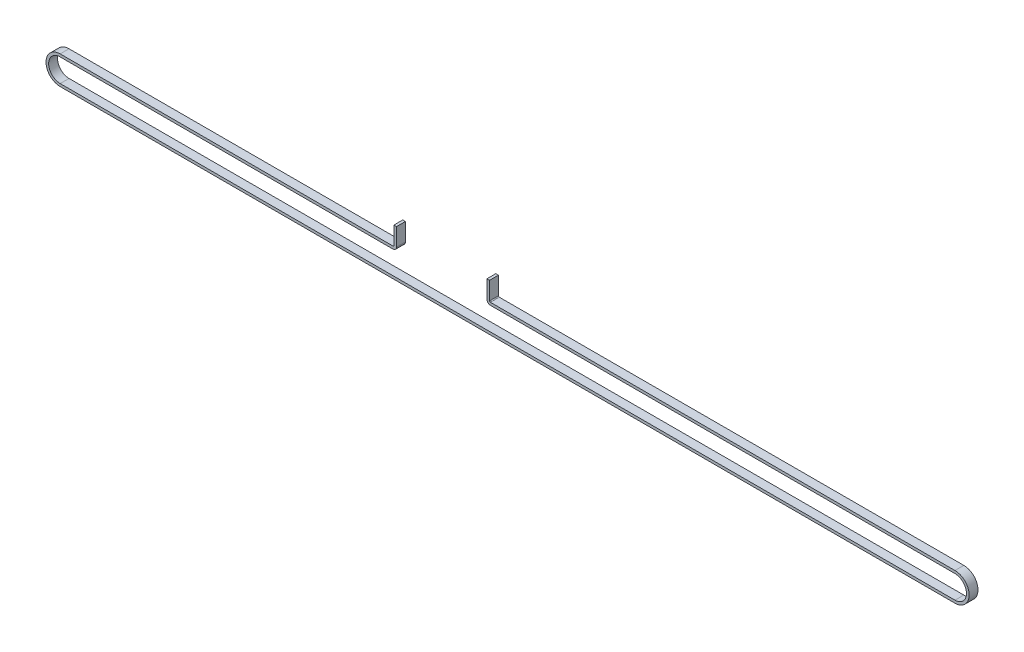
ISO-10303-21;
HEADER;
FILE_DESCRIPTION(('STEP AP214'),'2;1');
FILE_NAME('part.step','',(''),(''),'','','');
FILE_SCHEMA(('AUTOMOTIVE_DESIGN { 1 0 10303 214 1 1 1 1 }'));
ENDSEC;
DATA;
#1=APPLICATION_CONTEXT('core data for automotive mechanical design processes');
#2=APPLICATION_PROTOCOL_DEFINITION('international standard','automotive_design',2000,#1);
#3=PRODUCT_CONTEXT('',#1,'mechanical');
#4=PRODUCT('Part','Part','',(#3));
#5=PRODUCT_RELATED_PRODUCT_CATEGORY('part','',(#4));
#6=PRODUCT_DEFINITION_FORMATION('','',#4);
#7=PRODUCT_DEFINITION_CONTEXT('part definition',#1,'design');
#8=PRODUCT_DEFINITION('design','',#6,#7);
#9=PRODUCT_DEFINITION_SHAPE('','',#8);
#10=(LENGTH_UNIT() NAMED_UNIT(*) SI_UNIT(.MILLI.,.METRE.));
#11=(NAMED_UNIT(*) PLANE_ANGLE_UNIT() SI_UNIT($,.RADIAN.));
#12=(NAMED_UNIT(*) SI_UNIT($,.STERADIAN.) SOLID_ANGLE_UNIT());
#13=UNCERTAINTY_MEASURE_WITH_UNIT(LENGTH_MEASURE(1.E-05),#10,'distance_accuracy_value','');
#14=(GEOMETRIC_REPRESENTATION_CONTEXT(3) GLOBAL_UNCERTAINTY_ASSIGNED_CONTEXT((#13)) GLOBAL_UNIT_ASSIGNED_CONTEXT((#10,
#11,#12)) REPRESENTATION_CONTEXT('',''));
#15=CARTESIAN_POINT('',(0.,0.,0.));
#16=DIRECTION('',(0.,0.,1.));
#17=DIRECTION('',(1.,0.,0.));
#18=AXIS2_PLACEMENT_3D('',#15,#16,#17);
#19=CARTESIAN_POINT('',(187.83,8.5,5.));
#20=DIRECTION('',(0.,0.,-1.));
#21=DIRECTION('',(-1.,0.,0.));
#22=AXIS2_PLACEMENT_3D('',#19,#20,#21);
#23=CYLINDRICAL_SURFACE('',#22,0.5);
#24=CARTESIAN_POINT('',(187.83,8.5,0.));
#25=DIRECTION('',(0.,0.,-1.));
#26=DIRECTION('',(-1.,0.,0.));
#27=AXIS2_PLACEMENT_3D('',#24,#25,#26);
#28=CIRCLE('',#27,0.5);
#29=CARTESIAN_POINT('',(188.33,8.5,0.));
#30=VERTEX_POINT('',#29);
#31=CARTESIAN_POINT('',(187.83,8.,0.));
#32=VERTEX_POINT('',#31);
#33=EDGE_CURVE('E205',#30,#32,#28,.T.);
#34=ORIENTED_EDGE('',*,*,#33,.T.);
#35=DIRECTION('',(0.,0.,-1.));
#36=VECTOR('',#35,1.);
#37=CARTESIAN_POINT('',(187.83,8.,5.));
#38=LINE('',#37,#36);
#39=CARTESIAN_POINT('',(187.83,8.,5.));
#40=VERTEX_POINT('',#39);
#41=EDGE_CURVE('E11',#40,#32,#38,.T.);
#42=ORIENTED_EDGE('',*,*,#41,.F.);
#43=CARTESIAN_POINT('',(187.83,8.5,5.));
#44=DIRECTION('',(0.,0.,-1.));
#45=DIRECTION('',(-1.,0.,0.));
#46=AXIS2_PLACEMENT_3D('',#43,#44,#45);
#47=CIRCLE('',#46,0.5);
#48=CARTESIAN_POINT('',(188.33,8.5,5.));
#49=VERTEX_POINT('',#48);
#50=EDGE_CURVE('E243',#49,#40,#47,.T.);
#51=ORIENTED_EDGE('',*,*,#50,.F.);
#52=DIRECTION('',(0.,0.,-1.));
#53=VECTOR('',#52,1.);
#54=CARTESIAN_POINT('',(188.33,8.5,5.));
#55=LINE('',#54,#53);
#56=EDGE_CURVE('E201',#49,#30,#55,.T.);
#57=ORIENTED_EDGE('',*,*,#56,.T.);
#58=EDGE_LOOP('',(#34,#42,#51,#57));
#59=FACE_BOUND('',#58,.T.);
#60=ADVANCED_FACE('F37',(#59),#23,.F.);
#61=CARTESIAN_POINT('',(187.83,8.,5.));
#62=DIRECTION('',(0.,-1.,0.));
#63=DIRECTION('',(1.,0.,0.));
#64=AXIS2_PLACEMENT_3D('',#61,#62,#63);
#65=PLANE('',#64);
#66=DIRECTION('',(-1.,0.,0.));
#67=VECTOR('',#66,1.);
#68=CARTESIAN_POINT('',(187.83,8.,0.));
#69=LINE('',#68,#67);
#70=CARTESIAN_POINT('',(0.,8.,0.));
#71=VERTEX_POINT('',#70);
#72=EDGE_CURVE('E208',#32,#71,#69,.T.);
#73=ORIENTED_EDGE('',*,*,#72,.T.);
#74=DIRECTION('',(0.,0.,-1.));
#75=VECTOR('',#74,1.);
#76=CARTESIAN_POINT('',(0.,8.,5.));
#77=LINE('',#76,#75);
#78=CARTESIAN_POINT('',(0.,8.,5.));
#79=VERTEX_POINT('',#78);
#80=EDGE_CURVE('E45',#79,#71,#77,.T.);
#81=ORIENTED_EDGE('',*,*,#80,.F.);
#82=DIRECTION('',(-1.,0.,0.));
#83=VECTOR('',#82,1.);
#84=CARTESIAN_POINT('',(187.83,8.,5.));
#85=LINE('',#84,#83);
#86=EDGE_CURVE('E132',#40,#79,#85,.T.);
#87=ORIENTED_EDGE('',*,*,#86,.F.);
#88=ORIENTED_EDGE('',*,*,#41,.T.);
#89=EDGE_LOOP('',(#73,#81,#87,#88));
#90=FACE_BOUND('',#89,.T.);
#91=ADVANCED_FACE('F361',(#90),#65,.F.);
#92=CARTESIAN_POINT('',(0.,0.,5.));
#93=DIRECTION('',(0.,0.,-1.));
#94=DIRECTION('',(-1.,0.,0.));
#95=AXIS2_PLACEMENT_3D('',#92,#93,#94);
#96=CYLINDRICAL_SURFACE('',#95,8.);
#97=CARTESIAN_POINT('',(0.,0.,0.));
#98=DIRECTION('',(0.,0.,1.));
#99=DIRECTION('',(1.,0.,0.));
#100=AXIS2_PLACEMENT_3D('',#97,#98,#99);
#101=CIRCLE('',#100,8.);
#102=CARTESIAN_POINT('',(0.,-8.,0.));
#103=VERTEX_POINT('',#102);
#104=EDGE_CURVE('E210',#71,#103,#101,.T.);
#105=ORIENTED_EDGE('',*,*,#104,.T.);
#106=DIRECTION('',(0.,0.,-1.));
#107=VECTOR('',#106,1.);
#108=CARTESIAN_POINT('',(0.,-8.,5.));
#109=LINE('',#108,#107);
#110=CARTESIAN_POINT('',(0.,-8.,5.));
#111=VERTEX_POINT('',#110);
#112=EDGE_CURVE('E286',#111,#103,#109,.T.);
#113=ORIENTED_EDGE('',*,*,#112,.F.);
#114=CARTESIAN_POINT('',(0.,0.,5.));
#115=DIRECTION('',(0.,0.,1.));
#116=DIRECTION('',(1.,0.,0.));
#117=AXIS2_PLACEMENT_3D('',#114,#115,#116);
#118=CIRCLE('',#117,8.);
#119=EDGE_CURVE('E294',#79,#111,#118,.T.);
#120=ORIENTED_EDGE('',*,*,#119,.F.);
#121=ORIENTED_EDGE('',*,*,#80,.T.);
#122=EDGE_LOOP('',(#105,#113,#120,#121));
#123=FACE_BOUND('',#122,.T.);
#124=ADVANCED_FACE('F292',(#123),#96,.T.);
#125=CARTESIAN_POINT('',(0.,-8.,5.));
#126=DIRECTION('',(0.,1.,0.));
#127=DIRECTION('',(0.,0.,1.));
#128=AXIS2_PLACEMENT_3D('',#125,#126,#127);
#129=PLANE('',#128);
#130=DIRECTION('',(1.,0.,0.));
#131=VECTOR('',#130,1.);
#132=CARTESIAN_POINT('',(0.,-8.,0.));
#133=LINE('',#132,#131);
#134=CARTESIAN_POINT('',(505.,-7.99999999999995,0.));
#135=VERTEX_POINT('',#134);
#136=EDGE_CURVE('E212',#103,#135,#133,.T.);
#137=ORIENTED_EDGE('',*,*,#136,.T.);
#138=DIRECTION('',(0.,0.,-1.));
#139=VECTOR('',#138,1.);
#140=CARTESIAN_POINT('',(505.,-7.99999999999995,5.));
#141=LINE('',#140,#139);
#142=CARTESIAN_POINT('',(505.,-7.99999999999995,5.));
#143=VERTEX_POINT('',#142);
#144=EDGE_CURVE('E283',#143,#135,#141,.T.);
#145=ORIENTED_EDGE('',*,*,#144,.F.);
#146=DIRECTION('',(1.,0.,0.));
#147=VECTOR('',#146,1.);
#148=CARTESIAN_POINT('',(0.,-8.,5.));
#149=LINE('',#148,#147);
#150=EDGE_CURVE('E312',#111,#143,#149,.T.);
#151=ORIENTED_EDGE('',*,*,#150,.F.);
#152=ORIENTED_EDGE('',*,*,#112,.T.);
#153=EDGE_LOOP('',(#137,#145,#151,#152));
#154=FACE_BOUND('',#153,.T.);
#155=ADVANCED_FACE('F303',(#154),#129,.F.);
#156=CARTESIAN_POINT('',(505.,0.,5.));
#157=DIRECTION('',(0.,0.,-1.));
#158=DIRECTION('',(-1.,0.,0.));
#159=AXIS2_PLACEMENT_3D('',#156,#157,#158);
#160=CYLINDRICAL_SURFACE('',#159,7.99999999999995);
#161=CARTESIAN_POINT('',(505.,0.,0.));
#162=DIRECTION('',(0.,0.,1.));
#163=DIRECTION('',(1.,0.,0.));
#164=AXIS2_PLACEMENT_3D('',#161,#162,#163);
#165=CIRCLE('',#164,7.99999999999995);
#166=CARTESIAN_POINT('',(505.,7.9999999999999,0.));
#167=VERTEX_POINT('',#166);
#168=EDGE_CURVE('E214',#135,#167,#165,.T.);
#169=ORIENTED_EDGE('',*,*,#168,.T.);
#170=DIRECTION('',(0.,0.,-1.));
#171=VECTOR('',#170,1.);
#172=CARTESIAN_POINT('',(505.,7.9999999999999,5.));
#173=LINE('',#172,#171);
#174=CARTESIAN_POINT('',(505.,7.9999999999999,5.));
#175=VERTEX_POINT('',#174);
#176=EDGE_CURVE('E280',#175,#167,#173,.T.);
#177=ORIENTED_EDGE('',*,*,#176,.F.);
#178=CARTESIAN_POINT('',(505.,0.,5.));
#179=DIRECTION('',(0.,0.,1.));
#180=DIRECTION('',(1.,0.,0.));
#181=AXIS2_PLACEMENT_3D('',#178,#179,#180);
#182=CIRCLE('',#181,7.99999999999995);
#183=EDGE_CURVE('E309',#143,#175,#182,.T.);
#184=ORIENTED_EDGE('',*,*,#183,.F.);
#185=ORIENTED_EDGE('',*,*,#144,.T.);
#186=EDGE_LOOP('',(#169,#177,#184,#185));
#187=FACE_BOUND('',#186,.T.);
#188=ADVANCED_FACE('F307',(#187),#160,.T.);
#189=CARTESIAN_POINT('',(242.83,8.00000000000001,5.));
#190=DIRECTION('',(0.,-1.,0.));
#191=DIRECTION('',(1.,0.,0.));
#192=AXIS2_PLACEMENT_3D('',#189,#190,#191);
#193=PLANE('',#192);
#194=DIRECTION('',(-1.,0.,0.));
#195=VECTOR('',#194,1.);
#196=CARTESIAN_POINT('',(242.83,8.00000000000001,0.));
#197=LINE('',#196,#195);
#198=CARTESIAN_POINT('',(242.83,8.,0.));
#199=VERTEX_POINT('',#198);
#200=EDGE_CURVE('E216',#167,#199,#197,.T.);
#201=ORIENTED_EDGE('',*,*,#200,.T.);
#202=DIRECTION('',(0.,0.,-1.));
#203=VECTOR('',#202,1.);
#204=CARTESIAN_POINT('',(242.83,8.,5.));
#205=LINE('',#204,#203);
#206=CARTESIAN_POINT('',(242.83,8.,5.));
#207=VERTEX_POINT('',#206);
#208=EDGE_CURVE('E277',#207,#199,#205,.T.);
#209=ORIENTED_EDGE('',*,*,#208,.F.);
#210=DIRECTION('',(-1.,0.,0.));
#211=VECTOR('',#210,1.);
#212=CARTESIAN_POINT('',(242.83,8.00000000000001,5.));
#213=LINE('',#212,#211);
#214=EDGE_CURVE('E311',#175,#207,#213,.T.);
#215=ORIENTED_EDGE('',*,*,#214,.F.);
#216=ORIENTED_EDGE('',*,*,#176,.T.);
#217=EDGE_LOOP('',(#201,#209,#215,#216));
#218=FACE_BOUND('',#217,.T.);
#219=ADVANCED_FACE('F374',(#218),#193,.F.);
#220=CARTESIAN_POINT('',(242.83,8.5,5.));
#221=DIRECTION('',(0.,0.,-1.));
#222=DIRECTION('',(-1.,0.,0.));
#223=AXIS2_PLACEMENT_3D('',#220,#221,#222);
#224=CYLINDRICAL_SURFACE('',#223,0.5);
#225=CARTESIAN_POINT('',(242.83,8.5,0.));
#226=DIRECTION('',(0.,0.,-1.));
#227=DIRECTION('',(1.,0.,0.));
#228=AXIS2_PLACEMENT_3D('',#225,#226,#227);
#229=CIRCLE('',#228,0.5);
#230=CARTESIAN_POINT('',(242.33,8.5,0.));
#231=VERTEX_POINT('',#230);
#232=EDGE_CURVE('E218',#199,#231,#229,.T.);
#233=ORIENTED_EDGE('',*,*,#232,.T.);
#234=DIRECTION('',(0.,0.,-1.));
#235=VECTOR('',#234,1.);
#236=CARTESIAN_POINT('',(242.33,8.5,5.));
#237=LINE('',#236,#235);
#238=CARTESIAN_POINT('',(242.33,8.5,5.));
#239=VERTEX_POINT('',#238);
#240=EDGE_CURVE('E274',#239,#231,#237,.T.);
#241=ORIENTED_EDGE('',*,*,#240,.F.);
#242=CARTESIAN_POINT('',(242.83,8.5,5.));
#243=DIRECTION('',(0.,0.,-1.));
#244=DIRECTION('',(1.,0.,0.));
#245=AXIS2_PLACEMENT_3D('',#242,#243,#244);
#246=CIRCLE('',#245,0.5);
#247=EDGE_CURVE('E314',#207,#239,#246,.T.);
#248=ORIENTED_EDGE('',*,*,#247,.F.);
#249=ORIENTED_EDGE('',*,*,#208,.T.);
#250=EDGE_LOOP('',(#233,#241,#248,#249));
#251=FACE_BOUND('',#250,.T.);
#252=ADVANCED_FACE('F377',(#251),#224,.F.);
#253=CARTESIAN_POINT('',(242.33,8.5,5.));
#254=DIRECTION('',(-1.,0.,0.));
#255=DIRECTION('',(0.,-1.,0.));
#256=AXIS2_PLACEMENT_3D('',#253,#254,#255);
#257=PLANE('',#256);
#258=DIRECTION('',(0.,1.,0.));
#259=VECTOR('',#258,1.);
#260=CARTESIAN_POINT('',(242.33,8.5,0.));
#261=LINE('',#260,#259);
#262=CARTESIAN_POINT('',(242.33,18.5,0.));
#263=VERTEX_POINT('',#262);
#264=EDGE_CURVE('E220',#231,#263,#261,.T.);
#265=ORIENTED_EDGE('',*,*,#264,.T.);
#266=DIRECTION('',(0.,0.,-1.));
#267=VECTOR('',#266,1.);
#268=CARTESIAN_POINT('',(242.33,18.5,5.));
#269=LINE('',#268,#267);
#270=CARTESIAN_POINT('',(242.33,18.5,5.));
#271=VERTEX_POINT('',#270);
#272=EDGE_CURVE('E271',#271,#263,#269,.T.);
#273=ORIENTED_EDGE('',*,*,#272,.F.);
#274=DIRECTION('',(0.,1.,0.));
#275=VECTOR('',#274,1.);
#276=CARTESIAN_POINT('',(242.33,8.5,5.));
#277=LINE('',#276,#275);
#278=EDGE_CURVE('E320',#239,#271,#277,.T.);
#279=ORIENTED_EDGE('',*,*,#278,.F.);
#280=ORIENTED_EDGE('',*,*,#240,.T.);
#281=EDGE_LOOP('',(#265,#273,#279,#280));
#282=FACE_BOUND('',#281,.T.);
#283=ADVANCED_FACE('F381',(#282),#257,.F.);
#284=CARTESIAN_POINT('',(240.83,18.5,5.));
#285=DIRECTION('',(0.,-1.,0.));
#286=DIRECTION('',(0.,0.,-1.));
#287=AXIS2_PLACEMENT_3D('',#284,#285,#286);
#288=PLANE('',#287);
#289=DIRECTION('',(-1.,0.,0.));
#290=VECTOR('',#289,1.);
#291=CARTESIAN_POINT('',(240.83,18.5,0.));
#292=LINE('',#291,#290);
#293=CARTESIAN_POINT('',(240.83,18.5,0.));
#294=VERTEX_POINT('',#293);
#295=EDGE_CURVE('E222',#263,#294,#292,.T.);
#296=ORIENTED_EDGE('',*,*,#295,.T.);
#297=DIRECTION('',(0.,0.,-1.));
#298=VECTOR('',#297,1.);
#299=CARTESIAN_POINT('',(240.83,18.5,5.));
#300=LINE('',#299,#298);
#301=CARTESIAN_POINT('',(240.83,18.5,5.));
#302=VERTEX_POINT('',#301);
#303=EDGE_CURVE('E268',#302,#294,#300,.T.);
#304=ORIENTED_EDGE('',*,*,#303,.F.);
#305=DIRECTION('',(-1.,0.,0.));
#306=VECTOR('',#305,1.);
#307=CARTESIAN_POINT('',(240.83,18.5,5.));
#308=LINE('',#307,#306);
#309=EDGE_CURVE('E322',#271,#302,#308,.T.);
#310=ORIENTED_EDGE('',*,*,#309,.F.);
#311=ORIENTED_EDGE('',*,*,#272,.T.);
#312=EDGE_LOOP('',(#296,#304,#310,#311));
#313=FACE_BOUND('',#312,.T.);
#314=ADVANCED_FACE('F385',(#313),#288,.F.);
#315=CARTESIAN_POINT('',(240.83,18.5,5.));
#316=DIRECTION('',(1.,0.,0.));
#317=DIRECTION('',(0.,1.,0.));
#318=AXIS2_PLACEMENT_3D('',#315,#316,#317);
#319=PLANE('',#318);
#320=DIRECTION('',(0.,-1.,0.));
#321=VECTOR('',#320,1.);
#322=CARTESIAN_POINT('',(240.83,18.5,0.));
#323=LINE('',#322,#321);
#324=CARTESIAN_POINT('',(240.83,8.5,0.));
#325=VERTEX_POINT('',#324);
#326=EDGE_CURVE('E224',#294,#325,#323,.T.);
#327=ORIENTED_EDGE('',*,*,#326,.T.);
#328=DIRECTION('',(0.,0.,-1.));
#329=VECTOR('',#328,1.);
#330=CARTESIAN_POINT('',(240.83,8.5,5.));
#331=LINE('',#330,#329);
#332=CARTESIAN_POINT('',(240.83,8.5,5.));
#333=VERTEX_POINT('',#332);
#334=EDGE_CURVE('E265',#333,#325,#331,.T.);
#335=ORIENTED_EDGE('',*,*,#334,.F.);
#336=DIRECTION('',(0.,-1.,0.));
#337=VECTOR('',#336,1.);
#338=CARTESIAN_POINT('',(240.83,18.5,5.));
#339=LINE('',#338,#337);
#340=EDGE_CURVE('E324',#302,#333,#339,.T.);
#341=ORIENTED_EDGE('',*,*,#340,.F.);
#342=ORIENTED_EDGE('',*,*,#303,.T.);
#343=EDGE_LOOP('',(#327,#335,#341,#342));
#344=FACE_BOUND('',#343,.T.);
#345=ADVANCED_FACE('F389',(#344),#319,.F.);
#346=CARTESIAN_POINT('',(242.83,8.5,5.));
#347=DIRECTION('',(0.,0.,-1.));
#348=DIRECTION('',(-1.,0.,0.));
#349=AXIS2_PLACEMENT_3D('',#346,#347,#348);
#350=CYLINDRICAL_SURFACE('',#349,2.);
#351=CARTESIAN_POINT('',(242.83,8.5,0.));
#352=DIRECTION('',(0.,0.,1.));
#353=DIRECTION('',(1.,0.,0.));
#354=AXIS2_PLACEMENT_3D('',#351,#352,#353);
#355=CIRCLE('',#354,2.);
#356=CARTESIAN_POINT('',(242.83,6.50000000000001,0.));
#357=VERTEX_POINT('',#356);
#358=EDGE_CURVE('E226',#325,#357,#355,.T.);
#359=ORIENTED_EDGE('',*,*,#358,.T.);
#360=DIRECTION('',(0.,0.,-1.));
#361=VECTOR('',#360,1.);
#362=CARTESIAN_POINT('',(242.83,6.50000000000001,5.));
#363=LINE('',#362,#361);
#364=CARTESIAN_POINT('',(242.83,6.50000000000001,5.));
#365=VERTEX_POINT('',#364);
#366=EDGE_CURVE('E262',#365,#357,#363,.T.);
#367=ORIENTED_EDGE('',*,*,#366,.F.);
#368=CARTESIAN_POINT('',(242.83,8.5,5.));
#369=DIRECTION('',(0.,0.,1.));
#370=DIRECTION('',(1.,0.,0.));
#371=AXIS2_PLACEMENT_3D('',#368,#369,#370);
#372=CIRCLE('',#371,2.);
#373=EDGE_CURVE('E326',#333,#365,#372,.T.);
#374=ORIENTED_EDGE('',*,*,#373,.F.);
#375=ORIENTED_EDGE('',*,*,#334,.T.);
#376=EDGE_LOOP('',(#359,#367,#374,#375));
#377=FACE_BOUND('',#376,.T.);
#378=ADVANCED_FACE('F393',(#377),#350,.T.);
#379=CARTESIAN_POINT('',(242.83,6.50000000000001,5.));
#380=DIRECTION('',(0.,1.,0.));
#381=DIRECTION('',(-1.,0.,0.));
#382=AXIS2_PLACEMENT_3D('',#379,#380,#381);
#383=PLANE('',#382);
#384=DIRECTION('',(1.,0.,0.));
#385=VECTOR('',#384,1.);
#386=CARTESIAN_POINT('',(242.83,6.50000000000001,0.));
#387=LINE('',#386,#385);
#388=CARTESIAN_POINT('',(505.,6.4999999999999,0.));
#389=VERTEX_POINT('',#388);
#390=EDGE_CURVE('E228',#357,#389,#387,.T.);
#391=ORIENTED_EDGE('',*,*,#390,.T.);
#392=DIRECTION('',(0.,0.,-1.));
#393=VECTOR('',#392,1.);
#394=CARTESIAN_POINT('',(505.,6.4999999999999,5.));
#395=LINE('',#394,#393);
#396=CARTESIAN_POINT('',(505.,6.4999999999999,5.));
#397=VERTEX_POINT('',#396);
#398=EDGE_CURVE('E259',#397,#389,#395,.T.);
#399=ORIENTED_EDGE('',*,*,#398,.F.);
#400=DIRECTION('',(1.,0.,0.));
#401=VECTOR('',#400,1.);
#402=CARTESIAN_POINT('',(242.83,6.50000000000001,5.));
#403=LINE('',#402,#401);
#404=EDGE_CURVE('E328',#365,#397,#403,.T.);
#405=ORIENTED_EDGE('',*,*,#404,.F.);
#406=ORIENTED_EDGE('',*,*,#366,.T.);
#407=EDGE_LOOP('',(#391,#399,#405,#406));
#408=FACE_BOUND('',#407,.T.);
#409=ADVANCED_FACE('F397',(#408),#383,.F.);
#410=CARTESIAN_POINT('',(505.,0.,5.));
#411=DIRECTION('',(0.,0.,-1.));
#412=DIRECTION('',(-1.,0.,0.));
#413=AXIS2_PLACEMENT_3D('',#410,#411,#412);
#414=CYLINDRICAL_SURFACE('',#413,6.4999999999999);
#415=CARTESIAN_POINT('',(505.,0.,0.));
#416=DIRECTION('',(0.,0.,-1.));
#417=DIRECTION('',(1.,0.,0.));
#418=AXIS2_PLACEMENT_3D('',#415,#416,#417);
#419=CIRCLE('',#418,6.4999999999999);
#420=CARTESIAN_POINT('',(505.,-6.4999999999999,0.));
#421=VERTEX_POINT('',#420);
#422=EDGE_CURVE('E230',#389,#421,#419,.T.);
#423=ORIENTED_EDGE('',*,*,#422,.T.);
#424=DIRECTION('',(0.,0.,-1.));
#425=VECTOR('',#424,1.);
#426=CARTESIAN_POINT('',(505.,-6.4999999999999,5.));
#427=LINE('',#426,#425);
#428=CARTESIAN_POINT('',(505.,-6.4999999999999,5.));
#429=VERTEX_POINT('',#428);
#430=EDGE_CURVE('E256',#429,#421,#427,.T.);
#431=ORIENTED_EDGE('',*,*,#430,.F.);
#432=CARTESIAN_POINT('',(505.,0.,5.));
#433=DIRECTION('',(0.,0.,-1.));
#434=DIRECTION('',(1.,0.,0.));
#435=AXIS2_PLACEMENT_3D('',#432,#433,#434);
#436=CIRCLE('',#435,6.4999999999999);
#437=EDGE_CURVE('E330',#397,#429,#436,.T.);
#438=ORIENTED_EDGE('',*,*,#437,.F.);
#439=ORIENTED_EDGE('',*,*,#398,.T.);
#440=EDGE_LOOP('',(#423,#431,#438,#439));
#441=FACE_BOUND('',#440,.T.);
#442=ADVANCED_FACE('F401',(#441),#414,.F.);
#443=CARTESIAN_POINT('',(0.,-6.5,5.));
#444=DIRECTION('',(0.,-1.,0.));
#445=DIRECTION('',(1.,0.,0.));
#446=AXIS2_PLACEMENT_3D('',#443,#444,#445);
#447=PLANE('',#446);
#448=DIRECTION('',(-1.,0.,0.));
#449=VECTOR('',#448,1.);
#450=CARTESIAN_POINT('',(0.,-6.5,0.));
#451=LINE('',#450,#449);
#452=CARTESIAN_POINT('',(0.,-6.5,0.));
#453=VERTEX_POINT('',#452);
#454=EDGE_CURVE('E232',#421,#453,#451,.T.);
#455=ORIENTED_EDGE('',*,*,#454,.T.);
#456=DIRECTION('',(0.,0.,-1.));
#457=VECTOR('',#456,1.);
#458=CARTESIAN_POINT('',(0.,-6.5,5.));
#459=LINE('',#458,#457);
#460=CARTESIAN_POINT('',(0.,-6.5,5.));
#461=VERTEX_POINT('',#460);
#462=EDGE_CURVE('E253',#461,#453,#459,.T.);
#463=ORIENTED_EDGE('',*,*,#462,.F.);
#464=DIRECTION('',(-1.,0.,0.));
#465=VECTOR('',#464,1.);
#466=CARTESIAN_POINT('',(0.,-6.5,5.));
#467=LINE('',#466,#465);
#468=EDGE_CURVE('E332',#429,#461,#467,.T.);
#469=ORIENTED_EDGE('',*,*,#468,.F.);
#470=ORIENTED_EDGE('',*,*,#430,.T.);
#471=EDGE_LOOP('',(#455,#463,#469,#470));
#472=FACE_BOUND('',#471,.T.);
#473=ADVANCED_FACE('F405',(#472),#447,.F.);
#474=CARTESIAN_POINT('',(0.,0.,5.));
#475=DIRECTION('',(0.,0.,-1.));
#476=DIRECTION('',(-1.,0.,0.));
#477=AXIS2_PLACEMENT_3D('',#474,#475,#476);
#478=CYLINDRICAL_SURFACE('',#477,6.5);
#479=CARTESIAN_POINT('',(0.,0.,0.));
#480=DIRECTION('',(0.,0.,-1.));
#481=DIRECTION('',(1.,0.,0.));
#482=AXIS2_PLACEMENT_3D('',#479,#480,#481);
#483=CIRCLE('',#482,6.5);
#484=CARTESIAN_POINT('',(0.,6.5,0.));
#485=VERTEX_POINT('',#484);
#486=EDGE_CURVE('E234',#453,#485,#483,.T.);
#487=ORIENTED_EDGE('',*,*,#486,.T.);
#488=DIRECTION('',(0.,0.,-1.));
#489=VECTOR('',#488,1.);
#490=CARTESIAN_POINT('',(0.,6.5,5.));
#491=LINE('',#490,#489);
#492=CARTESIAN_POINT('',(0.,6.5,5.));
#493=VERTEX_POINT('',#492);
#494=EDGE_CURVE('E250',#493,#485,#491,.T.);
#495=ORIENTED_EDGE('',*,*,#494,.F.);
#496=CARTESIAN_POINT('',(0.,0.,5.));
#497=DIRECTION('',(0.,0.,-1.));
#498=DIRECTION('',(1.,0.,0.));
#499=AXIS2_PLACEMENT_3D('',#496,#497,#498);
#500=CIRCLE('',#499,6.5);
#501=EDGE_CURVE('E334',#461,#493,#500,.T.);
#502=ORIENTED_EDGE('',*,*,#501,.F.);
#503=ORIENTED_EDGE('',*,*,#462,.T.);
#504=EDGE_LOOP('',(#487,#495,#502,#503));
#505=FACE_BOUND('',#504,.T.);
#506=ADVANCED_FACE('F409',(#505),#478,.F.);
#507=CARTESIAN_POINT('',(187.83,6.5,5.));
#508=DIRECTION('',(0.,1.,0.));
#509=DIRECTION('',(-1.,0.,0.));
#510=AXIS2_PLACEMENT_3D('',#507,#508,#509);
#511=PLANE('',#510);
#512=DIRECTION('',(1.,0.,0.));
#513=VECTOR('',#512,1.);
#514=CARTESIAN_POINT('',(187.83,6.5,0.));
#515=LINE('',#514,#513);
#516=CARTESIAN_POINT('',(187.83,6.49999999999998,0.));
#517=VERTEX_POINT('',#516);
#518=EDGE_CURVE('E236',#485,#517,#515,.T.);
#519=ORIENTED_EDGE('',*,*,#518,.T.);
#520=DIRECTION('',(0.,0.,-1.));
#521=VECTOR('',#520,1.);
#522=CARTESIAN_POINT('',(187.83,6.49999999999998,5.));
#523=LINE('',#522,#521);
#524=CARTESIAN_POINT('',(187.83,6.49999999999998,5.));
#525=VERTEX_POINT('',#524);
#526=EDGE_CURVE('E247',#525,#517,#523,.T.);
#527=ORIENTED_EDGE('',*,*,#526,.F.);
#528=DIRECTION('',(1.,0.,0.));
#529=VECTOR('',#528,1.);
#530=CARTESIAN_POINT('',(187.83,6.5,5.));
#531=LINE('',#530,#529);
#532=EDGE_CURVE('E336',#493,#525,#531,.T.);
#533=ORIENTED_EDGE('',*,*,#532,.F.);
#534=ORIENTED_EDGE('',*,*,#494,.T.);
#535=EDGE_LOOP('',(#519,#527,#533,#534));
#536=FACE_BOUND('',#535,.T.);
#537=ADVANCED_FACE('F342',(#536),#511,.F.);
#538=CARTESIAN_POINT('',(187.83,8.5,5.));
#539=DIRECTION('',(0.,0.,-1.));
#540=DIRECTION('',(-1.,0.,0.));
#541=AXIS2_PLACEMENT_3D('',#538,#539,#540);
#542=CYLINDRICAL_SURFACE('',#541,2.00000000000001);
#543=CARTESIAN_POINT('',(187.83,8.5,0.));
#544=DIRECTION('',(0.,0.,1.));
#545=DIRECTION('',(-1.,0.,0.));
#546=AXIS2_PLACEMENT_3D('',#543,#544,#545);
#547=CIRCLE('',#546,2.00000000000001);
#548=CARTESIAN_POINT('',(189.83,8.5,0.));
#549=VERTEX_POINT('',#548);
#550=EDGE_CURVE('E238',#517,#549,#547,.T.);
#551=ORIENTED_EDGE('',*,*,#550,.T.);
#552=DIRECTION('',(0.,0.,-1.));
#553=VECTOR('',#552,1.);
#554=CARTESIAN_POINT('',(189.83,8.5,5.));
#555=LINE('',#554,#553);
#556=CARTESIAN_POINT('',(189.83,8.5,5.));
#557=VERTEX_POINT('',#556);
#558=EDGE_CURVE('E196',#557,#549,#555,.T.);
#559=ORIENTED_EDGE('',*,*,#558,.F.);
#560=CARTESIAN_POINT('',(187.83,8.5,5.));
#561=DIRECTION('',(0.,0.,1.));
#562=DIRECTION('',(-1.,0.,0.));
#563=AXIS2_PLACEMENT_3D('',#560,#561,#562);
#564=CIRCLE('',#563,2.00000000000001);
#565=EDGE_CURVE('E187',#525,#557,#564,.T.);
#566=ORIENTED_EDGE('',*,*,#565,.F.);
#567=ORIENTED_EDGE('',*,*,#526,.T.);
#568=EDGE_LOOP('',(#551,#559,#566,#567));
#569=FACE_BOUND('',#568,.T.);
#570=ADVANCED_FACE('F346',(#569),#542,.T.);
#571=CARTESIAN_POINT('',(189.83,18.5,5.));
#572=DIRECTION('',(-1.,0.,0.));
#573=DIRECTION('',(0.,0.,1.));
#574=AXIS2_PLACEMENT_3D('',#571,#572,#573);
#575=PLANE('',#574);
#576=DIRECTION('',(0.,1.,0.));
#577=VECTOR('',#576,1.);
#578=CARTESIAN_POINT('',(189.83,18.5,0.));
#579=LINE('',#578,#577);
#580=CARTESIAN_POINT('',(189.83,18.5,0.));
#581=VERTEX_POINT('',#580);
#582=EDGE_CURVE('E195',#549,#581,#579,.T.);
#583=ORIENTED_EDGE('',*,*,#582,.T.);
#584=DIRECTION('',(0.,0.,-1.));
#585=VECTOR('',#584,1.);
#586=CARTESIAN_POINT('',(189.83,18.5,5.));
#587=LINE('',#586,#585);
#588=CARTESIAN_POINT('',(189.83,18.5,5.));
#589=VERTEX_POINT('',#588);
#590=EDGE_CURVE('E192',#589,#581,#587,.T.);
#591=ORIENTED_EDGE('',*,*,#590,.F.);
#592=DIRECTION('',(0.,1.,0.));
#593=VECTOR('',#592,1.);
#594=CARTESIAN_POINT('',(189.83,18.5,5.));
#595=LINE('',#594,#593);
#596=EDGE_CURVE('E181',#557,#589,#595,.T.);
#597=ORIENTED_EDGE('',*,*,#596,.F.);
#598=ORIENTED_EDGE('',*,*,#558,.T.);
#599=EDGE_LOOP('',(#583,#591,#597,#598));
#600=FACE_BOUND('',#599,.T.);
#601=ADVANCED_FACE('F193',(#600),#575,.F.);
#602=CARTESIAN_POINT('',(188.33,18.5,5.));
#603=DIRECTION('',(0.,-1.,0.));
#604=DIRECTION('',(0.,0.,-1.));
#605=AXIS2_PLACEMENT_3D('',#602,#603,#604);
#606=PLANE('',#605);
#607=DIRECTION('',(-1.,0.,0.));
#608=VECTOR('',#607,1.);
#609=CARTESIAN_POINT('',(188.33,18.5,0.));
#610=LINE('',#609,#608);
#611=CARTESIAN_POINT('',(188.33,18.5,0.));
#612=VERTEX_POINT('',#611);
#613=EDGE_CURVE('E118',#581,#612,#610,.T.);
#614=ORIENTED_EDGE('',*,*,#613,.T.);
#615=DIRECTION('',(0.,0.,-1.));
#616=VECTOR('',#615,1.);
#617=CARTESIAN_POINT('',(188.33,18.5,5.));
#618=LINE('',#617,#616);
#619=CARTESIAN_POINT('',(188.33,18.5,5.));
#620=VERTEX_POINT('',#619);
#621=EDGE_CURVE('E197',#620,#612,#618,.T.);
#622=ORIENTED_EDGE('',*,*,#621,.F.);
#623=DIRECTION('',(-1.,0.,0.));
#624=VECTOR('',#623,1.);
#625=CARTESIAN_POINT('',(188.33,18.5,5.));
#626=LINE('',#625,#624);
#627=EDGE_CURVE('E185',#589,#620,#626,.T.);
#628=ORIENTED_EDGE('',*,*,#627,.F.);
#629=ORIENTED_EDGE('',*,*,#590,.T.);
#630=EDGE_LOOP('',(#614,#622,#628,#629));
#631=FACE_BOUND('',#630,.T.);
#632=ADVANCED_FACE('F199',(#631),#606,.F.);
#633=CARTESIAN_POINT('',(188.33,8.5,5.));
#634=DIRECTION('',(1.,0.,0.));
#635=DIRECTION('',(0.,1.,0.));
#636=AXIS2_PLACEMENT_3D('',#633,#634,#635);
#637=PLANE('',#636);
#638=DIRECTION('',(0.,-1.,0.));
#639=VECTOR('',#638,1.);
#640=CARTESIAN_POINT('',(188.33,8.5,0.));
#641=LINE('',#640,#639);
#642=EDGE_CURVE('E124',#612,#30,#641,.T.);
#643=ORIENTED_EDGE('',*,*,#642,.T.);
#644=ORIENTED_EDGE('',*,*,#56,.F.);
#645=DIRECTION('',(0.,-1.,0.));
#646=VECTOR('',#645,1.);
#647=CARTESIAN_POINT('',(188.33,8.5,5.));
#648=LINE('',#647,#646);
#649=EDGE_CURVE('E53',#620,#49,#648,.T.);
#650=ORIENTED_EDGE('',*,*,#649,.F.);
#651=ORIENTED_EDGE('',*,*,#621,.T.);
#652=EDGE_LOOP('',(#643,#644,#650,#651));
#653=FACE_BOUND('',#652,.T.);
#654=ADVANCED_FACE('F350',(#653),#637,.F.);
#655=CARTESIAN_POINT('',(187.83,8.5,5.));
#656=DIRECTION('',(0.,0.,-1.));
#657=DIRECTION('',(-1.,0.,0.));
#658=AXIS2_PLACEMENT_3D('',#655,#656,#657);
#659=PLANE('',#658);
#660=ORIENTED_EDGE('',*,*,#50,.T.);
#661=ORIENTED_EDGE('',*,*,#86,.T.);
#662=ORIENTED_EDGE('',*,*,#119,.T.);
#663=ORIENTED_EDGE('',*,*,#150,.T.);
#664=ORIENTED_EDGE('',*,*,#183,.T.);
#665=ORIENTED_EDGE('',*,*,#214,.T.);
#666=ORIENTED_EDGE('',*,*,#247,.T.);
#667=ORIENTED_EDGE('',*,*,#278,.T.);
#668=ORIENTED_EDGE('',*,*,#309,.T.);
#669=ORIENTED_EDGE('',*,*,#340,.T.);
#670=ORIENTED_EDGE('',*,*,#373,.T.);
#671=ORIENTED_EDGE('',*,*,#404,.T.);
#672=ORIENTED_EDGE('',*,*,#437,.T.);
#673=ORIENTED_EDGE('',*,*,#468,.T.);
#674=ORIENTED_EDGE('',*,*,#501,.T.);
#675=ORIENTED_EDGE('',*,*,#532,.T.);
#676=ORIENTED_EDGE('',*,*,#565,.T.);
#677=ORIENTED_EDGE('',*,*,#596,.T.);
#678=ORIENTED_EDGE('',*,*,#627,.T.);
#679=ORIENTED_EDGE('',*,*,#649,.T.);
#680=EDGE_LOOP('',(#660,#661,#662,#663,#664,#665,#666,#667,#668,#669,#670,#671,#672,#673,#674,
#675,#676,#677,#678,#679));
#681=FACE_BOUND('',#680,.T.);
#682=ADVANCED_FACE('F183',(#681),#659,.F.);
#683=CARTESIAN_POINT('',(187.83,8.5,0.));
#684=DIRECTION('',(0.,0.,-1.));
#685=DIRECTION('',(-1.,0.,0.));
#686=AXIS2_PLACEMENT_3D('',#683,#684,#685);
#687=PLANE('',#686);
#688=ORIENTED_EDGE('',*,*,#33,.F.);
#689=ORIENTED_EDGE('',*,*,#642,.F.);
#690=ORIENTED_EDGE('',*,*,#613,.F.);
#691=ORIENTED_EDGE('',*,*,#582,.F.);
#692=ORIENTED_EDGE('',*,*,#550,.F.);
#693=ORIENTED_EDGE('',*,*,#518,.F.);
#694=ORIENTED_EDGE('',*,*,#486,.F.);
#695=ORIENTED_EDGE('',*,*,#454,.F.);
#696=ORIENTED_EDGE('',*,*,#422,.F.);
#697=ORIENTED_EDGE('',*,*,#390,.F.);
#698=ORIENTED_EDGE('',*,*,#358,.F.);
#699=ORIENTED_EDGE('',*,*,#326,.F.);
#700=ORIENTED_EDGE('',*,*,#295,.F.);
#701=ORIENTED_EDGE('',*,*,#264,.F.);
#702=ORIENTED_EDGE('',*,*,#232,.F.);
#703=ORIENTED_EDGE('',*,*,#200,.F.);
#704=ORIENTED_EDGE('',*,*,#168,.F.);
#705=ORIENTED_EDGE('',*,*,#136,.F.);
#706=ORIENTED_EDGE('',*,*,#104,.F.);
#707=ORIENTED_EDGE('',*,*,#72,.F.);
#708=EDGE_LOOP('',(#688,#689,#690,#691,#692,#693,#694,#695,#696,#697,#698,#699,#700,#701,#702,
#703,#704,#705,#706,#707));
#709=FACE_BOUND('',#708,.T.);
#710=ADVANCED_FACE('F298',(#709),#687,.T.);
#711=CLOSED_SHELL('',(#60,#91,#124,#155,#188,#219,#252,#283,#314,#345,#378,#409,#442,#473,#506,
#537,#570,#601,#632,#654,#682,#710));
#712=MANIFOLD_SOLID_BREP('B2',#711);
#713=ADVANCED_BREP_SHAPE_REPRESENTATION('',(#18,#712),#14);
#714=SHAPE_DEFINITION_REPRESENTATION(#9,#713);
ENDSEC;
END-ISO-10303-21;
